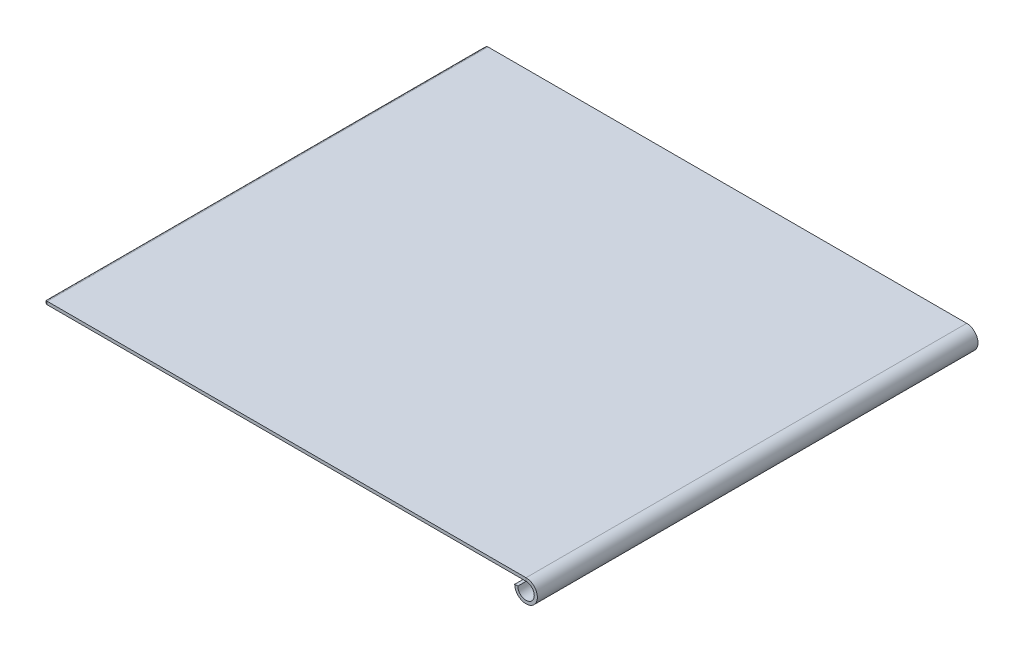
ISO-10303-21;
HEADER;
FILE_DESCRIPTION(('STEP AP214'),'2;1');
FILE_NAME('part.step','',(''),(''),'','','');
FILE_SCHEMA(('AUTOMOTIVE_DESIGN { 1 0 10303 214 1 1 1 1 }'));
ENDSEC;
DATA;
#1=APPLICATION_CONTEXT('core data for automotive mechanical design processes');
#2=APPLICATION_PROTOCOL_DEFINITION('international standard','automotive_design',2000,#1);
#3=PRODUCT_CONTEXT('',#1,'mechanical');
#4=PRODUCT('Part','Part','',(#3));
#5=PRODUCT_RELATED_PRODUCT_CATEGORY('part','',(#4));
#6=PRODUCT_DEFINITION_FORMATION('','',#4);
#7=PRODUCT_DEFINITION_CONTEXT('part definition',#1,'design');
#8=PRODUCT_DEFINITION('design','',#6,#7);
#9=PRODUCT_DEFINITION_SHAPE('','',#8);
#10=(LENGTH_UNIT() NAMED_UNIT(*) SI_UNIT(.MILLI.,.METRE.));
#11=(NAMED_UNIT(*) PLANE_ANGLE_UNIT() SI_UNIT($,.RADIAN.));
#12=(NAMED_UNIT(*) SI_UNIT($,.STERADIAN.) SOLID_ANGLE_UNIT());
#13=UNCERTAINTY_MEASURE_WITH_UNIT(LENGTH_MEASURE(1.E-05),#10,'distance_accuracy_value','');
#14=(GEOMETRIC_REPRESENTATION_CONTEXT(3) GLOBAL_UNCERTAINTY_ASSIGNED_CONTEXT((#13)) GLOBAL_UNIT_ASSIGNED_CONTEXT((#10,
#11,#12)) REPRESENTATION_CONTEXT('',''));
#15=CARTESIAN_POINT('',(0.,0.,0.));
#16=DIRECTION('',(0.,0.,1.));
#17=DIRECTION('',(1.,0.,0.));
#18=AXIS2_PLACEMENT_3D('',#15,#16,#17);
#19=CARTESIAN_POINT('',(-115.5,0.,0.));
#20=DIRECTION('',(0.,0.,-1.));
#21=DIRECTION('',(-1.,0.,0.));
#22=AXIS2_PLACEMENT_3D('',#19,#20,#21);
#23=CYLINDRICAL_SURFACE('',#22,1.5);
#24=CARTESIAN_POINT('',(-115.5,0.,105.5));
#25=DIRECTION('',(0.,-0.707106781186547,-0.707106781186547));
#26=DIRECTION('',(0.,0.707106781186547,-0.707106781186547));
#27=AXIS2_PLACEMENT_3D('',#24,#25,#26);
#28=ELLIPSE('',#27,2.12132034355964,1.5);
#29=CARTESIAN_POINT('',(-115.5,-1.5,107.));
#30=VERTEX_POINT('',#29);
#31=CARTESIAN_POINT('',(-116.799038105677,-0.75,106.25));
#32=VERTEX_POINT('',#31);
#33=EDGE_CURVE('E161',#30,#32,#28,.T.);
#34=ORIENTED_EDGE('',*,*,#33,.T.);
#35=DIRECTION('',(0.,0.,-1.));
#36=VECTOR('',#35,1.);
#37=CARTESIAN_POINT('',(-116.799038105677,-0.75,107.));
#38=LINE('',#37,#36);
#39=CARTESIAN_POINT('',(-116.799038105677,-0.750000000000005,-106.25));
#40=VERTEX_POINT('',#39);
#41=EDGE_CURVE('E11',#32,#40,#38,.T.);
#42=ORIENTED_EDGE('',*,*,#41,.T.);
#43=CARTESIAN_POINT('',(-115.5,0.,-105.5));
#44=DIRECTION('',(0.,0.707106781186547,-0.707106781186547));
#45=DIRECTION('',(0.,-0.707106781186547,-0.707106781186547));
#46=AXIS2_PLACEMENT_3D('',#43,#44,#45);
#47=ELLIPSE('',#46,2.12132034355964,1.5);
#48=CARTESIAN_POINT('',(-115.5,-1.5,-107.));
#49=VERTEX_POINT('',#48);
#50=EDGE_CURVE('E156',#49,#40,#47,.T.);
#51=ORIENTED_EDGE('',*,*,#50,.F.);
#52=DIRECTION('',(0.,0.,-1.));
#53=VECTOR('',#52,1.);
#54=CARTESIAN_POINT('',(-115.5,-1.5,0.));
#55=LINE('',#54,#53);
#56=EDGE_CURVE('E45',#30,#49,#55,.T.);
#57=ORIENTED_EDGE('',*,*,#56,.F.);
#58=EDGE_LOOP('',(#34,#42,#51,#57));
#59=FACE_BOUND('',#58,.T.);
#60=ADVANCED_FACE('F37',(#59),#23,.T.);
#61=CARTESIAN_POINT('',(-115.5,0.,105.5));
#62=DIRECTION('',(0.,-1.,0.));
#63=DIRECTION('',(0.,0.,-1.));
#64=AXIS2_PLACEMENT_3D('',#61,#62,#63);
#65=CYLINDRICAL_SURFACE('',#64,1.5);
#66=CARTESIAN_POINT('',(-115.5,-1.5,105.5));
#67=DIRECTION('',(0.,-0.707106781186547,0.707106781186547));
#68=DIRECTION('',(0.,-0.707106781186547,-0.707106781186547));
#69=AXIS2_PLACEMENT_3D('',#66,#67,#68);
#70=ELLIPSE('',#69,2.12132034355964,1.5);
#71=CARTESIAN_POINT('',(-115.5,0.,107.));
#72=VERTEX_POINT('',#71);
#73=EDGE_CURVE('E126',#32,#72,#70,.F.);
#74=ORIENTED_EDGE('',*,*,#73,.F.);
#75=ORIENTED_EDGE('',*,*,#33,.F.);
#76=DIRECTION('',(0.,-1.,0.));
#77=VECTOR('',#76,1.);
#78=CARTESIAN_POINT('',(-115.5,0.,107.));
#79=LINE('',#78,#77);
#80=EDGE_CURVE('E152',#72,#30,#79,.T.);
#81=ORIENTED_EDGE('',*,*,#80,.F.);
#82=EDGE_LOOP('',(#74,#75,#81));
#83=FACE_BOUND('',#82,.T.);
#84=ADVANCED_FACE('F39',(#83),#65,.T.);
#85=CARTESIAN_POINT('',(-115.5,-1.5,107.));
#86=DIRECTION('',(0.,0.,1.));
#87=DIRECTION('',(1.,0.,0.));
#88=AXIS2_PLACEMENT_3D('',#85,#86,#87);
#89=CYLINDRICAL_SURFACE('',#88,1.5);
#90=ORIENTED_EDGE('',*,*,#41,.F.);
#91=ORIENTED_EDGE('',*,*,#73,.T.);
#92=DIRECTION('',(0.,0.,-1.));
#93=VECTOR('',#92,1.);
#94=CARTESIAN_POINT('',(-115.5,0.,107.));
#95=LINE('',#94,#93);
#96=CARTESIAN_POINT('',(-115.5,0.,-107.));
#97=VERTEX_POINT('',#96);
#98=EDGE_CURVE('E150',#97,#72,#95,.F.);
#99=ORIENTED_EDGE('',*,*,#98,.F.);
#100=CARTESIAN_POINT('',(-115.5,-1.5,-105.5));
#101=DIRECTION('',(0.,0.707106781186547,0.707106781186547));
#102=DIRECTION('',(0.,-0.707106781186547,0.707106781186547));
#103=AXIS2_PLACEMENT_3D('',#100,#101,#102);
#104=ELLIPSE('',#103,2.12132034355964,1.5);
#105=EDGE_CURVE('E159',#40,#97,#104,.F.);
#106=ORIENTED_EDGE('',*,*,#105,.F.);
#107=EDGE_LOOP('',(#90,#91,#99,#106));
#108=FACE_BOUND('',#107,.T.);
#109=ADVANCED_FACE('F164',(#108),#89,.T.);
#110=CARTESIAN_POINT('',(-115.5,0.,-105.5));
#111=DIRECTION('',(0.,-1.,0.));
#112=DIRECTION('',(0.,0.,-1.));
#113=AXIS2_PLACEMENT_3D('',#110,#111,#112);
#114=CYLINDRICAL_SURFACE('',#113,1.5);
#115=ORIENTED_EDGE('',*,*,#50,.T.);
#116=ORIENTED_EDGE('',*,*,#105,.T.);
#117=DIRECTION('',(0.,-1.,0.));
#118=VECTOR('',#117,1.);
#119=CARTESIAN_POINT('',(-115.5,0.,-107.));
#120=LINE('',#119,#118);
#121=EDGE_CURVE('E145',#49,#97,#120,.F.);
#122=ORIENTED_EDGE('',*,*,#121,.F.);
#123=EDGE_LOOP('',(#115,#116,#122));
#124=FACE_BOUND('',#123,.T.);
#125=ADVANCED_FACE('F178',(#124),#114,.T.);
#126=CARTESIAN_POINT('',(-117.,0.,-107.));
#127=DIRECTION('',(0.,0.,-1.));
#128=DIRECTION('',(-1.,0.,0.));
#129=AXIS2_PLACEMENT_3D('',#126,#127,#128);
#130=PLANE('',#129);
#131=DIRECTION('',(1.,0.,0.));
#132=VECTOR('',#131,1.);
#133=CARTESIAN_POINT('',(-117.,-1.5,-107.));
#134=LINE('',#133,#132);
#135=CARTESIAN_POINT('',(117.,-1.5,-107.));
#136=VERTEX_POINT('',#135);
#137=EDGE_CURVE('E133',#49,#136,#134,.T.);
#138=ORIENTED_EDGE('',*,*,#137,.F.);
#139=ORIENTED_EDGE('',*,*,#121,.T.);
#140=DIRECTION('',(1.,0.,0.));
#141=VECTOR('',#140,1.);
#142=CARTESIAN_POINT('',(-117.,0.,-107.));
#143=LINE('',#142,#141);
#144=CARTESIAN_POINT('',(117.,0.,-107.));
#145=VERTEX_POINT('',#144);
#146=EDGE_CURVE('E136',#97,#145,#143,.T.);
#147=ORIENTED_EDGE('',*,*,#146,.T.);
#148=DIRECTION('',(0.,-1.,0.));
#149=VECTOR('',#148,1.);
#150=CARTESIAN_POINT('',(117.,0.,-107.));
#151=LINE('',#150,#149);
#152=EDGE_CURVE('E118',#145,#136,#151,.T.);
#153=ORIENTED_EDGE('',*,*,#152,.T.);
#154=EDGE_LOOP('',(#138,#139,#147,#153));
#155=FACE_BOUND('',#154,.T.);
#156=ADVANCED_FACE('F181',(#155),#130,.T.);
#157=CARTESIAN_POINT('',(-117.,0.,107.));
#158=DIRECTION('',(0.,0.,1.));
#159=DIRECTION('',(1.,0.,0.));
#160=AXIS2_PLACEMENT_3D('',#157,#158,#159);
#161=PLANE('',#160);
#162=DIRECTION('',(-1.,0.,0.));
#163=VECTOR('',#162,1.);
#164=CARTESIAN_POINT('',(-117.,0.,107.));
#165=LINE('',#164,#163);
#166=CARTESIAN_POINT('',(117.,0.,107.));
#167=VERTEX_POINT('',#166);
#168=EDGE_CURVE('E132',#167,#72,#165,.T.);
#169=ORIENTED_EDGE('',*,*,#168,.T.);
#170=ORIENTED_EDGE('',*,*,#80,.T.);
#171=DIRECTION('',(-1.,0.,0.));
#172=VECTOR('',#171,1.);
#173=CARTESIAN_POINT('',(-117.,-1.5,107.));
#174=LINE('',#173,#172);
#175=CARTESIAN_POINT('',(117.,-1.50000000000001,107.));
#176=VERTEX_POINT('',#175);
#177=EDGE_CURVE('E140',#176,#30,#174,.T.);
#178=ORIENTED_EDGE('',*,*,#177,.F.);
#179=DIRECTION('',(0.,-1.,0.));
#180=VECTOR('',#179,1.);
#181=CARTESIAN_POINT('',(117.,0.,107.));
#182=LINE('',#181,#180);
#183=EDGE_CURVE('E138',#167,#176,#182,.T.);
#184=ORIENTED_EDGE('',*,*,#183,.F.);
#185=EDGE_LOOP('',(#169,#170,#178,#184));
#186=FACE_BOUND('',#185,.T.);
#187=ADVANCED_FACE('F169',(#186),#161,.T.);
#188=CARTESIAN_POINT('',(0.,0.,0.));
#189=DIRECTION('',(0.,-1.,0.));
#190=DIRECTION('',(0.,0.,-1.));
#191=AXIS2_PLACEMENT_3D('',#188,#189,#190);
#192=PLANE('',#191);
#193=ORIENTED_EDGE('',*,*,#146,.F.);
#194=ORIENTED_EDGE('',*,*,#98,.T.);
#195=ORIENTED_EDGE('',*,*,#168,.F.);
#196=DIRECTION('',(0.,0.,1.));
#197=VECTOR('',#196,1.);
#198=CARTESIAN_POINT('',(117.,0.,107.));
#199=LINE('',#198,#197);
#200=EDGE_CURVE('E130',#145,#167,#199,.T.);
#201=ORIENTED_EDGE('',*,*,#200,.F.);
#202=EDGE_LOOP('',(#193,#194,#195,#201));
#203=FACE_BOUND('',#202,.T.);
#204=ADVANCED_FACE('F184',(#203),#192,.F.);
#205=CARTESIAN_POINT('',(0.,-1.5,0.));
#206=DIRECTION('',(0.,-1.,0.));
#207=DIRECTION('',(0.,0.,-1.));
#208=AXIS2_PLACEMENT_3D('',#205,#206,#207);
#209=PLANE('',#208);
#210=ORIENTED_EDGE('',*,*,#177,.T.);
#211=ORIENTED_EDGE('',*,*,#56,.T.);
#212=ORIENTED_EDGE('',*,*,#137,.T.);
#213=DIRECTION('',(0.,0.,1.));
#214=VECTOR('',#213,1.);
#215=CARTESIAN_POINT('',(117.,-1.5,107.));
#216=LINE('',#215,#214);
#217=EDGE_CURVE('E129',#136,#176,#216,.T.);
#218=ORIENTED_EDGE('',*,*,#217,.T.);
#219=EDGE_LOOP('',(#210,#211,#212,#218));
#220=FACE_BOUND('',#219,.T.);
#221=ADVANCED_FACE('F173',(#220),#209,.T.);
#222=CARTESIAN_POINT('',(113.,-5.49999999999996,0.));
#223=DIRECTION('',(0.,-1.,0.));
#224=DIRECTION('',(0.,0.,1.));
#225=AXIS2_PLACEMENT_3D('',#222,#223,#224);
#226=PLANE('',#225);
#227=DIRECTION('',(-1.,0.,0.));
#228=VECTOR('',#227,1.);
#229=CARTESIAN_POINT('',(113.,-5.49999999999996,107.));
#230=LINE('',#229,#228);
#231=CARTESIAN_POINT('',(113.,-5.49999999999996,107.));
#232=VERTEX_POINT('',#231);
#233=CARTESIAN_POINT('',(111.5,-5.49999999999995,107.));
#234=VERTEX_POINT('',#233);
#235=EDGE_CURVE('E103',#232,#234,#230,.T.);
#236=ORIENTED_EDGE('',*,*,#235,.F.);
#237=DIRECTION('',(0.,0.,1.));
#238=VECTOR('',#237,1.);
#239=CARTESIAN_POINT('',(113.,-5.49999999999996,107.));
#240=LINE('',#239,#238);
#241=CARTESIAN_POINT('',(113.,-5.49999999999996,-107.));
#242=VERTEX_POINT('',#241);
#243=EDGE_CURVE('E98',#242,#232,#240,.T.);
#244=ORIENTED_EDGE('',*,*,#243,.F.);
#245=DIRECTION('',(-1.,0.,0.));
#246=VECTOR('',#245,1.);
#247=CARTESIAN_POINT('',(113.,-5.49999999999996,-107.));
#248=LINE('',#247,#246);
#249=CARTESIAN_POINT('',(111.5,-5.49999999999995,-107.));
#250=VERTEX_POINT('',#249);
#251=EDGE_CURVE('E93',#242,#250,#248,.T.);
#252=ORIENTED_EDGE('',*,*,#251,.T.);
#253=DIRECTION('',(0.,0.,1.));
#254=VECTOR('',#253,1.);
#255=CARTESIAN_POINT('',(111.5,-5.49999999999995,107.));
#256=LINE('',#255,#254);
#257=EDGE_CURVE('E96',#250,#234,#256,.T.);
#258=ORIENTED_EDGE('',*,*,#257,.T.);
#259=EDGE_LOOP('',(#236,#244,#252,#258));
#260=FACE_BOUND('',#259,.T.);
#261=ADVANCED_FACE('F95',(#260),#226,.F.);
#262=CARTESIAN_POINT('',(117.,-5.5,-107.));
#263=DIRECTION('',(0.,0.,-1.));
#264=DIRECTION('',(-1.,0.,0.));
#265=AXIS2_PLACEMENT_3D('',#262,#263,#264);
#266=PLANE('',#265);
#267=ORIENTED_EDGE('',*,*,#251,.F.);
#268=CARTESIAN_POINT('',(117.,-5.5,-107.));
#269=DIRECTION('',(0.,0.,1.));
#270=DIRECTION('',(1.,0.,0.));
#271=AXIS2_PLACEMENT_3D('',#268,#269,#270);
#272=CIRCLE('',#271,3.99999999999999);
#273=EDGE_CURVE('E113',#136,#242,#272,.F.);
#274=ORIENTED_EDGE('',*,*,#273,.F.);
#275=ORIENTED_EDGE('',*,*,#152,.F.);
#276=CARTESIAN_POINT('',(117.,-5.5,-107.));
#277=DIRECTION('',(0.,0.,1.));
#278=DIRECTION('',(1.,0.,0.));
#279=AXIS2_PLACEMENT_3D('',#276,#277,#278);
#280=CIRCLE('',#279,5.49999999999999);
#281=EDGE_CURVE('E104',#145,#250,#280,.F.);
#282=ORIENTED_EDGE('',*,*,#281,.T.);
#283=EDGE_LOOP('',(#267,#274,#275,#282));
#284=FACE_BOUND('',#283,.T.);
#285=ADVANCED_FACE('F116',(#284),#266,.T.);
#286=CARTESIAN_POINT('',(117.,-5.5,107.));
#287=DIRECTION('',(0.,0.,-1.));
#288=DIRECTION('',(-1.,0.,0.));
#289=AXIS2_PLACEMENT_3D('',#286,#287,#288);
#290=PLANE('',#289);
#291=CARTESIAN_POINT('',(117.,-5.5,107.));
#292=DIRECTION('',(0.,0.,1.));
#293=DIRECTION('',(1.,0.,0.));
#294=AXIS2_PLACEMENT_3D('',#291,#292,#293);
#295=CIRCLE('',#294,3.99999999999999);
#296=EDGE_CURVE('E123',#232,#176,#295,.T.);
#297=ORIENTED_EDGE('',*,*,#296,.F.);
#298=ORIENTED_EDGE('',*,*,#235,.T.);
#299=CARTESIAN_POINT('',(117.,-5.5,107.));
#300=DIRECTION('',(0.,0.,1.));
#301=DIRECTION('',(1.,0.,0.));
#302=AXIS2_PLACEMENT_3D('',#299,#300,#301);
#303=CIRCLE('',#302,5.49999999999999);
#304=EDGE_CURVE('E112',#234,#167,#303,.T.);
#305=ORIENTED_EDGE('',*,*,#304,.T.);
#306=ORIENTED_EDGE('',*,*,#183,.T.);
#307=EDGE_LOOP('',(#297,#298,#305,#306));
#308=FACE_BOUND('',#307,.T.);
#309=ADVANCED_FACE('F187',(#308),#290,.F.);
#310=CARTESIAN_POINT('',(117.,-5.5,107.));
#311=DIRECTION('',(0.,0.,1.));
#312=DIRECTION('',(-1.,0.,0.));
#313=AXIS2_PLACEMENT_3D('',#310,#311,#312);
#314=CYLINDRICAL_SURFACE('',#313,5.49999999999999);
#315=ORIENTED_EDGE('',*,*,#200,.T.);
#316=ORIENTED_EDGE('',*,*,#304,.F.);
#317=ORIENTED_EDGE('',*,*,#257,.F.);
#318=ORIENTED_EDGE('',*,*,#281,.F.);
#319=EDGE_LOOP('',(#315,#316,#317,#318));
#320=FACE_BOUND('',#319,.T.);
#321=ADVANCED_FACE('F110',(#320),#314,.T.);
#322=CARTESIAN_POINT('',(117.,-5.5,107.));
#323=DIRECTION('',(0.,0.,1.));
#324=DIRECTION('',(-1.,0.,0.));
#325=AXIS2_PLACEMENT_3D('',#322,#323,#324);
#326=CYLINDRICAL_SURFACE('',#325,3.99999999999999);
#327=ORIENTED_EDGE('',*,*,#217,.F.);
#328=ORIENTED_EDGE('',*,*,#273,.T.);
#329=ORIENTED_EDGE('',*,*,#243,.T.);
#330=ORIENTED_EDGE('',*,*,#296,.T.);
#331=EDGE_LOOP('',(#327,#328,#329,#330));
#332=FACE_BOUND('',#331,.T.);
#333=ADVANCED_FACE('F189',(#332),#326,.F.);
#334=CLOSED_SHELL('',(#60,#84,#109,#125,#156,#187,#204,#221,#261,#285,#309,#321,#333));
#335=MANIFOLD_SOLID_BREP('B2',#334);
#336=ADVANCED_BREP_SHAPE_REPRESENTATION('',(#18,#335),#14);
#337=SHAPE_DEFINITION_REPRESENTATION(#9,#336);
ENDSEC;
END-ISO-10303-21;
